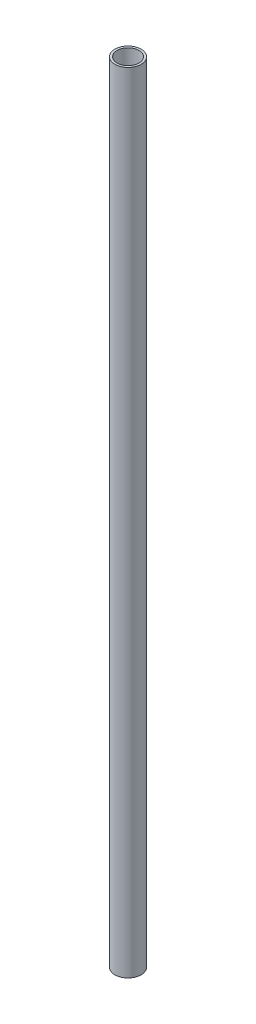
ISO-10303-21;
HEADER;
FILE_DESCRIPTION(('STEP AP214'),'2;1');
FILE_NAME('part.step','',(''),(''),'','','');
FILE_SCHEMA(('AUTOMOTIVE_DESIGN { 1 0 10303 214 1 1 1 1 }'));
ENDSEC;
DATA;
#1=APPLICATION_CONTEXT('core data for automotive mechanical design processes');
#2=APPLICATION_PROTOCOL_DEFINITION('international standard','automotive_design',2000,#1);
#3=PRODUCT_CONTEXT('',#1,'mechanical');
#4=PRODUCT('Part','Part','',(#3));
#5=PRODUCT_RELATED_PRODUCT_CATEGORY('part','',(#4));
#6=PRODUCT_DEFINITION_FORMATION('','',#4);
#7=PRODUCT_DEFINITION_CONTEXT('part definition',#1,'design');
#8=PRODUCT_DEFINITION('design','',#6,#7);
#9=PRODUCT_DEFINITION_SHAPE('','',#8);
#10=(LENGTH_UNIT() NAMED_UNIT(*) SI_UNIT(.MILLI.,.METRE.));
#11=(NAMED_UNIT(*) PLANE_ANGLE_UNIT() SI_UNIT($,.RADIAN.));
#12=(NAMED_UNIT(*) SI_UNIT($,.STERADIAN.) SOLID_ANGLE_UNIT());
#13=UNCERTAINTY_MEASURE_WITH_UNIT(LENGTH_MEASURE(1.E-05),#10,'distance_accuracy_value','');
#14=(GEOMETRIC_REPRESENTATION_CONTEXT(3) GLOBAL_UNCERTAINTY_ASSIGNED_CONTEXT((#13)) GLOBAL_UNIT_ASSIGNED_CONTEXT((#10,
#11,#12)) REPRESENTATION_CONTEXT('',''));
#15=CARTESIAN_POINT('',(0.,0.,0.));
#16=DIRECTION('',(0.,0.,1.));
#17=DIRECTION('',(1.,0.,0.));
#18=AXIS2_PLACEMENT_3D('',#15,#16,#17);
#19=CARTESIAN_POINT('',(0.,180.,0.));
#20=DIRECTION('',(0.,1.,0.));
#21=DIRECTION('',(0.,0.,1.));
#22=AXIS2_PLACEMENT_3D('',#19,#20,#21);
#23=PLANE('',#22);
#24=CARTESIAN_POINT('',(0.,180.,0.));
#25=DIRECTION('',(0.,1.,0.));
#26=DIRECTION('',(0.,0.,1.));
#27=AXIS2_PLACEMENT_3D('',#24,#25,#26);
#28=CIRCLE('',#27,3.);
#29=CARTESIAN_POINT('',(0.,180.,-3.));
#30=VERTEX_POINT('',#29);
#31=EDGE_CURVE('E10',#30,#30,#28,.T.);
#32=ORIENTED_EDGE('',*,*,#31,.T.);
#33=EDGE_LOOP('',(#32));
#34=FACE_BOUND('',#33,.T.);
#35=CARTESIAN_POINT('',(0.,180.,0.));
#36=DIRECTION('',(0.,1.,0.));
#37=DIRECTION('',(0.,0.,1.));
#38=AXIS2_PLACEMENT_3D('',#35,#36,#37);
#39=CIRCLE('',#38,2.5);
#40=CARTESIAN_POINT('',(0.,180.,-2.5));
#41=VERTEX_POINT('',#40);
#42=EDGE_CURVE('E45',#41,#41,#39,.T.);
#43=ORIENTED_EDGE('',*,*,#42,.F.);
#44=EDGE_LOOP('',(#43));
#45=FACE_BOUND('',#44,.T.);
#46=ADVANCED_FACE('F34',(#34,#45),#23,.T.);
#47=CARTESIAN_POINT('',(0.,0.,0.));
#48=DIRECTION('',(0.,1.,0.));
#49=DIRECTION('',(0.,0.,1.));
#50=AXIS2_PLACEMENT_3D('',#47,#48,#49);
#51=PLANE('',#50);
#52=CARTESIAN_POINT('',(0.,0.,0.));
#53=DIRECTION('',(0.,1.,0.));
#54=DIRECTION('',(0.,0.,1.));
#55=AXIS2_PLACEMENT_3D('',#52,#53,#54);
#56=CIRCLE('',#55,3.);
#57=CARTESIAN_POINT('',(0.,0.,-3.));
#58=VERTEX_POINT('',#57);
#59=EDGE_CURVE('E38',#58,#58,#56,.T.);
#60=ORIENTED_EDGE('',*,*,#59,.F.);
#61=EDGE_LOOP('',(#60));
#62=FACE_BOUND('',#61,.T.);
#63=CARTESIAN_POINT('',(0.,0.,0.));
#64=DIRECTION('',(0.,1.,0.));
#65=DIRECTION('',(0.,0.,1.));
#66=AXIS2_PLACEMENT_3D('',#63,#64,#65);
#67=CIRCLE('',#66,2.5);
#68=CARTESIAN_POINT('',(0.,0.,-2.5));
#69=VERTEX_POINT('',#68);
#70=EDGE_CURVE('E47',#69,#69,#67,.T.);
#71=ORIENTED_EDGE('',*,*,#70,.T.);
#72=EDGE_LOOP('',(#71));
#73=FACE_BOUND('',#72,.T.);
#74=ADVANCED_FACE('F57',(#62,#73),#51,.F.);
#75=CARTESIAN_POINT('',(0.,180.,0.));
#76=DIRECTION('',(0.,-1.,0.));
#77=DIRECTION('',(0.,0.,-1.));
#78=AXIS2_PLACEMENT_3D('',#75,#76,#77);
#79=CYLINDRICAL_SURFACE('',#78,3.);
#80=CARTESIAN_POINT('',(0.,180.,-3.));
#81=CARTESIAN_POINT('',(0.,178.125,-3.));
#82=CARTESIAN_POINT('',(0.,176.25,-3.));
#83=CARTESIAN_POINT('',(0.,172.5,-3.));
#84=CARTESIAN_POINT('',(0.,170.625,-3.));
#85=CARTESIAN_POINT('',(0.,166.875,-3.));
#86=CARTESIAN_POINT('',(0.,165.,-3.));
#87=CARTESIAN_POINT('',(0.,161.25,-3.));
#88=CARTESIAN_POINT('',(0.,159.375,-3.));
#89=CARTESIAN_POINT('',(0.,155.625,-3.));
#90=CARTESIAN_POINT('',(0.,153.75,-3.));
#91=CARTESIAN_POINT('',(0.,150.,-3.));
#92=CARTESIAN_POINT('',(0.,148.125,-3.));
#93=CARTESIAN_POINT('',(0.,144.375,-3.));
#94=CARTESIAN_POINT('',(0.,142.5,-3.));
#95=CARTESIAN_POINT('',(0.,138.75,-3.));
#96=CARTESIAN_POINT('',(0.,136.875,-3.));
#97=CARTESIAN_POINT('',(0.,133.125,-3.));
#98=CARTESIAN_POINT('',(0.,131.25,-3.));
#99=CARTESIAN_POINT('',(0.,127.5,-3.));
#100=CARTESIAN_POINT('',(0.,125.625,-3.));
#101=CARTESIAN_POINT('',(0.,121.875,-3.));
#102=CARTESIAN_POINT('',(0.,120.,-3.));
#103=CARTESIAN_POINT('',(0.,116.25,-3.));
#104=CARTESIAN_POINT('',(0.,114.375,-3.));
#105=CARTESIAN_POINT('',(0.,110.625,-3.));
#106=CARTESIAN_POINT('',(0.,108.75,-3.));
#107=CARTESIAN_POINT('',(0.,105.,-3.));
#108=CARTESIAN_POINT('',(0.,103.125,-3.));
#109=CARTESIAN_POINT('',(0.,99.375,-3.));
#110=CARTESIAN_POINT('',(0.,97.5,-3.));
#111=CARTESIAN_POINT('',(0.,93.75,-3.));
#112=CARTESIAN_POINT('',(0.,91.875,-3.));
#113=CARTESIAN_POINT('',(0.,88.125,-3.));
#114=CARTESIAN_POINT('',(0.,86.25,-3.));
#115=CARTESIAN_POINT('',(0.,82.5,-3.));
#116=CARTESIAN_POINT('',(0.,80.625,-3.));
#117=CARTESIAN_POINT('',(0.,76.875,-3.));
#118=CARTESIAN_POINT('',(0.,75.,-3.));
#119=CARTESIAN_POINT('',(0.,71.25,-3.));
#120=CARTESIAN_POINT('',(0.,69.375,-3.));
#121=CARTESIAN_POINT('',(0.,65.625,-3.));
#122=CARTESIAN_POINT('',(0.,63.75,-3.));
#123=CARTESIAN_POINT('',(0.,60.,-3.));
#124=CARTESIAN_POINT('',(0.,58.125,-3.));
#125=CARTESIAN_POINT('',(0.,54.375,-3.));
#126=CARTESIAN_POINT('',(0.,52.5,-3.));
#127=CARTESIAN_POINT('',(0.,48.75,-3.));
#128=CARTESIAN_POINT('',(0.,46.875,-3.));
#129=CARTESIAN_POINT('',(0.,43.125,-3.));
#130=CARTESIAN_POINT('',(0.,41.25,-3.));
#131=CARTESIAN_POINT('',(0.,37.5,-3.));
#132=CARTESIAN_POINT('',(0.,35.625,-3.));
#133=CARTESIAN_POINT('',(0.,31.875,-3.));
#134=CARTESIAN_POINT('',(0.,30.,-3.));
#135=CARTESIAN_POINT('',(0.,26.25,-3.));
#136=CARTESIAN_POINT('',(0.,24.375,-3.));
#137=CARTESIAN_POINT('',(0.,20.625,-3.));
#138=CARTESIAN_POINT('',(0.,18.75,-3.));
#139=CARTESIAN_POINT('',(0.,15.,-3.));
#140=CARTESIAN_POINT('',(0.,13.125,-3.));
#141=CARTESIAN_POINT('',(0.,9.37499999999998,-3.));
#142=CARTESIAN_POINT('',(0.,7.49999999999997,-3.));
#143=CARTESIAN_POINT('',(0.,3.74999999999997,-3.));
#144=CARTESIAN_POINT('',(0.,1.87499999999997,-3.));
#145=CARTESIAN_POINT('',(0.,0.,-3.));
#146=B_SPLINE_CURVE_WITH_KNOTS('',3,(#80,#81,#82,#83,#84,#85,#86,#87,#88,#89,#90,#91,#92,#93,
#94,#95,#96,#97,#98,#99,#100,#101,#102,#103,#104,#105,#106,#107,#108,#109,#110,#111,#112,#113,
#114,#115,#116,#117,#118,#119,#120,#121,#122,#123,#124,#125,#126,#127,#128,#129,#130,#131,#132,
#133,#134,#135,#136,#137,#138,#139,#140,#141,#142,#143,#144,#145),.UNSPECIFIED.,.F.,.F.,(4,2,2,
2,2,2,2,2,2,2,2,2,2,2,2,2,2,2,2,2,2,2,2,2,2,2,2,2,2,2,2,2,4),(0.,5.62500000000002,11.25,16.875,
22.5,28.125,33.75,39.375,45.,50.625,56.25,61.875,67.5,73.125,78.75,84.375,90.,95.625,101.25,
106.875,112.5,118.125,123.75,129.375,135.,140.625,146.25,151.875,157.5,163.125,168.75,174.375,
180.),.UNSPECIFIED.);
#147=EDGE_CURVE('BSEAM36',#30,#58,#146,.T.);
#148=ORIENTED_EDGE('',*,*,#31,.F.);
#149=ORIENTED_EDGE('',*,*,#59,.T.);
#150=ORIENTED_EDGE('',*,*,#147,.T.);
#151=ORIENTED_EDGE('',*,*,#147,.F.);
#152=EDGE_LOOP('',(#148,#150,#149,#151));
#153=FACE_BOUND('',#152,.T.);
#154=ADVANCED_FACE('F36',(#153),#79,.T.);
#155=CARTESIAN_POINT('',(0.,180.,0.));
#156=DIRECTION('',(0.,-1.,0.));
#157=DIRECTION('',(0.,0.,-1.));
#158=AXIS2_PLACEMENT_3D('',#155,#156,#157);
#159=CYLINDRICAL_SURFACE('',#158,2.5);
#160=CARTESIAN_POINT('',(0.,180.,-2.5));
#161=CARTESIAN_POINT('',(0.,178.125,-2.5));
#162=CARTESIAN_POINT('',(0.,176.25,-2.5));
#163=CARTESIAN_POINT('',(0.,172.5,-2.5));
#164=CARTESIAN_POINT('',(0.,170.625,-2.5));
#165=CARTESIAN_POINT('',(0.,166.875,-2.5));
#166=CARTESIAN_POINT('',(0.,165.,-2.5));
#167=CARTESIAN_POINT('',(0.,161.25,-2.5));
#168=CARTESIAN_POINT('',(0.,159.375,-2.5));
#169=CARTESIAN_POINT('',(0.,155.625,-2.5));
#170=CARTESIAN_POINT('',(0.,153.75,-2.5));
#171=CARTESIAN_POINT('',(0.,150.,-2.5));
#172=CARTESIAN_POINT('',(0.,148.125,-2.5));
#173=CARTESIAN_POINT('',(0.,144.375,-2.5));
#174=CARTESIAN_POINT('',(0.,142.5,-2.5));
#175=CARTESIAN_POINT('',(0.,138.75,-2.5));
#176=CARTESIAN_POINT('',(0.,136.875,-2.5));
#177=CARTESIAN_POINT('',(0.,133.125,-2.5));
#178=CARTESIAN_POINT('',(0.,131.25,-2.5));
#179=CARTESIAN_POINT('',(0.,127.5,-2.5));
#180=CARTESIAN_POINT('',(0.,125.625,-2.5));
#181=CARTESIAN_POINT('',(0.,121.875,-2.5));
#182=CARTESIAN_POINT('',(0.,120.,-2.5));
#183=CARTESIAN_POINT('',(0.,116.25,-2.5));
#184=CARTESIAN_POINT('',(0.,114.375,-2.5));
#185=CARTESIAN_POINT('',(0.,110.625,-2.5));
#186=CARTESIAN_POINT('',(0.,108.75,-2.5));
#187=CARTESIAN_POINT('',(0.,105.,-2.5));
#188=CARTESIAN_POINT('',(0.,103.125,-2.5));
#189=CARTESIAN_POINT('',(0.,99.375,-2.5));
#190=CARTESIAN_POINT('',(0.,97.5,-2.5));
#191=CARTESIAN_POINT('',(0.,93.75,-2.5));
#192=CARTESIAN_POINT('',(0.,91.875,-2.5));
#193=CARTESIAN_POINT('',(0.,88.125,-2.5));
#194=CARTESIAN_POINT('',(0.,86.25,-2.5));
#195=CARTESIAN_POINT('',(0.,82.5,-2.5));
#196=CARTESIAN_POINT('',(0.,80.625,-2.5));
#197=CARTESIAN_POINT('',(0.,76.875,-2.5));
#198=CARTESIAN_POINT('',(0.,75.,-2.5));
#199=CARTESIAN_POINT('',(0.,71.25,-2.5));
#200=CARTESIAN_POINT('',(0.,69.375,-2.5));
#201=CARTESIAN_POINT('',(0.,65.625,-2.5));
#202=CARTESIAN_POINT('',(0.,63.75,-2.5));
#203=CARTESIAN_POINT('',(0.,60.,-2.5));
#204=CARTESIAN_POINT('',(0.,58.125,-2.5));
#205=CARTESIAN_POINT('',(0.,54.375,-2.5));
#206=CARTESIAN_POINT('',(0.,52.5,-2.5));
#207=CARTESIAN_POINT('',(0.,48.75,-2.5));
#208=CARTESIAN_POINT('',(0.,46.875,-2.5));
#209=CARTESIAN_POINT('',(0.,43.125,-2.5));
#210=CARTESIAN_POINT('',(0.,41.25,-2.5));
#211=CARTESIAN_POINT('',(0.,37.5,-2.5));
#212=CARTESIAN_POINT('',(0.,35.625,-2.5));
#213=CARTESIAN_POINT('',(0.,31.875,-2.5));
#214=CARTESIAN_POINT('',(0.,30.,-2.5));
#215=CARTESIAN_POINT('',(0.,26.25,-2.5));
#216=CARTESIAN_POINT('',(0.,24.375,-2.5));
#217=CARTESIAN_POINT('',(0.,20.625,-2.5));
#218=CARTESIAN_POINT('',(0.,18.75,-2.5));
#219=CARTESIAN_POINT('',(0.,15.,-2.5));
#220=CARTESIAN_POINT('',(0.,13.125,-2.5));
#221=CARTESIAN_POINT('',(0.,9.37499999999998,-2.5));
#222=CARTESIAN_POINT('',(0.,7.49999999999997,-2.5));
#223=CARTESIAN_POINT('',(0.,3.74999999999997,-2.5));
#224=CARTESIAN_POINT('',(0.,1.87499999999997,-2.5));
#225=CARTESIAN_POINT('',(0.,0.,-2.5));
#226=B_SPLINE_CURVE_WITH_KNOTS('',3,(#160,#161,#162,#163,#164,#165,#166,#167,#168,#169,#170,
#171,#172,#173,#174,#175,#176,#177,#178,#179,#180,#181,#182,#183,#184,#185,#186,#187,#188,#189,
#190,#191,#192,#193,#194,#195,#196,#197,#198,#199,#200,#201,#202,#203,#204,#205,#206,#207,#208,
#209,#210,#211,#212,#213,#214,#215,#216,#217,#218,#219,#220,#221,#222,#223,#224,#225),
.UNSPECIFIED.,.F.,.F.,(4,2,2,2,2,2,2,2,2,2,2,2,2,2,2,2,2,2,2,2,2,2,2,2,2,2,2,2,2,2,2,2,4),(0.,
5.62499999999999,11.25,16.875,22.5,28.125,33.75,39.375,45.,50.625,56.25,61.875,67.5,73.125,
78.75,84.375,90.,95.625,101.25,106.875,112.5,118.125,123.75,129.375,135.,140.625,146.25,151.875,
157.5,163.125,168.75,174.375,180.),.UNSPECIFIED.);
#227=EDGE_CURVE('BSEAM53',#41,#69,#226,.T.);
#228=ORIENTED_EDGE('',*,*,#42,.T.);
#229=ORIENTED_EDGE('',*,*,#70,.F.);
#230=ORIENTED_EDGE('',*,*,#227,.T.);
#231=ORIENTED_EDGE('',*,*,#227,.F.);
#232=EDGE_LOOP('',(#228,#230,#229,#231));
#233=FACE_BOUND('',#232,.T.);
#234=ADVANCED_FACE('F53',(#233),#159,.F.);
#235=CLOSED_SHELL('',(#46,#74,#154,#234));
#236=MANIFOLD_SOLID_BREP('B2',#235);
#237=ADVANCED_BREP_SHAPE_REPRESENTATION('',(#18,#236),#14);
#238=SHAPE_DEFINITION_REPRESENTATION(#9,#237);
ENDSEC;
END-ISO-10303-21;
